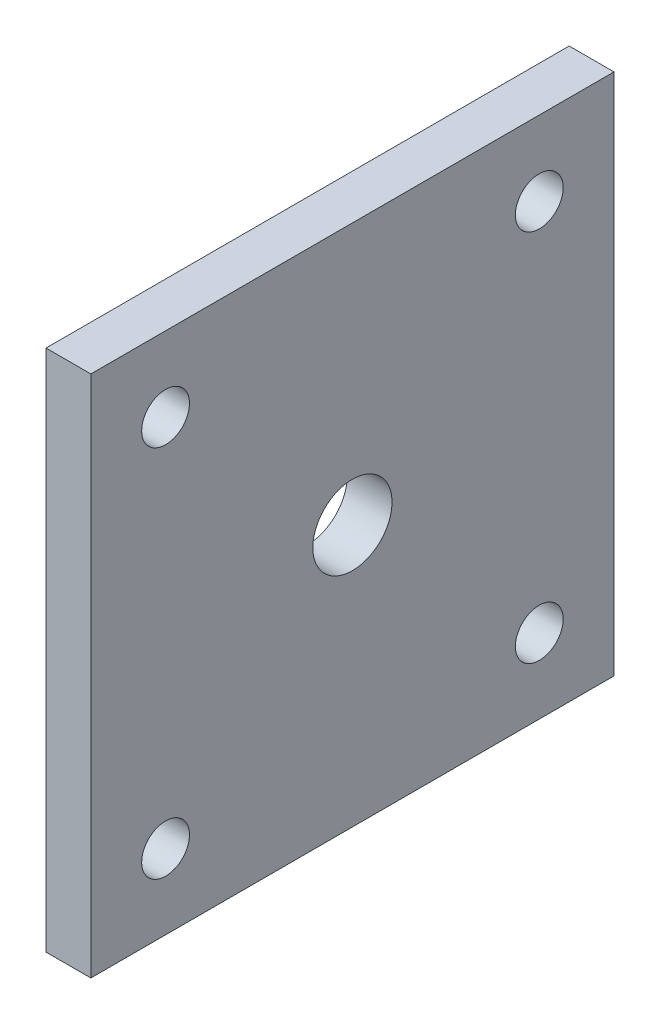
ISO-10303-21;
HEADER;
FILE_DESCRIPTION(('STEP AP214'),'2;1');
FILE_NAME('part.step','',(''),(''),'','','');
FILE_SCHEMA(('AUTOMOTIVE_DESIGN { 1 0 10303 214 1 1 1 1 }'));
ENDSEC;
DATA;
#1=APPLICATION_CONTEXT('core data for automotive mechanical design processes');
#2=APPLICATION_PROTOCOL_DEFINITION('international standard','automotive_design',2000,#1);
#3=PRODUCT_CONTEXT('',#1,'mechanical');
#4=PRODUCT('Part','Part','',(#3));
#5=PRODUCT_RELATED_PRODUCT_CATEGORY('part','',(#4));
#6=PRODUCT_DEFINITION_FORMATION('','',#4);
#7=PRODUCT_DEFINITION_CONTEXT('part definition',#1,'design');
#8=PRODUCT_DEFINITION('design','',#6,#7);
#9=PRODUCT_DEFINITION_SHAPE('','',#8);
#10=(LENGTH_UNIT() NAMED_UNIT(*) SI_UNIT(.MILLI.,.METRE.));
#11=(NAMED_UNIT(*) PLANE_ANGLE_UNIT() SI_UNIT($,.RADIAN.));
#12=(NAMED_UNIT(*) SI_UNIT($,.STERADIAN.) SOLID_ANGLE_UNIT());
#13=UNCERTAINTY_MEASURE_WITH_UNIT(LENGTH_MEASURE(1.E-05),#10,'distance_accuracy_value','');
#14=(GEOMETRIC_REPRESENTATION_CONTEXT(3) GLOBAL_UNCERTAINTY_ASSIGNED_CONTEXT((#13)) GLOBAL_UNIT_ASSIGNED_CONTEXT((#10,
#11,#12)) REPRESENTATION_CONTEXT('',''));
#15=CARTESIAN_POINT('',(0.,0.,0.));
#16=DIRECTION('',(0.,0.,1.));
#17=DIRECTION('',(1.,0.,0.));
#18=AXIS2_PLACEMENT_3D('',#15,#16,#17);
#19=CARTESIAN_POINT('',(3.,17.5,-17.5));
#20=DIRECTION('',(0.,0.,1.));
#21=DIRECTION('',(1.,0.,0.));
#22=AXIS2_PLACEMENT_3D('',#19,#20,#21);
#23=PLANE('',#22);
#24=DIRECTION('',(0.,1.,0.));
#25=VECTOR('',#24,1.);
#26=CARTESIAN_POINT('',(0.,17.5,-17.5));
#27=LINE('',#26,#25);
#28=CARTESIAN_POINT('',(0.,-17.5,-17.5));
#29=VERTEX_POINT('',#28);
#30=CARTESIAN_POINT('',(0.,17.5,-17.5));
#31=VERTEX_POINT('',#30);
#32=EDGE_CURVE('E112',#29,#31,#27,.T.);
#33=ORIENTED_EDGE('',*,*,#32,.T.);
#34=DIRECTION('',(-1.,0.,0.));
#35=VECTOR('',#34,1.);
#36=CARTESIAN_POINT('',(3.,17.5,-17.5));
#37=LINE('',#36,#35);
#38=CARTESIAN_POINT('',(3.,17.5,-17.5));
#39=VERTEX_POINT('',#38);
#40=EDGE_CURVE('E11',#39,#31,#37,.T.);
#41=ORIENTED_EDGE('',*,*,#40,.F.);
#42=DIRECTION('',(0.,1.,0.));
#43=VECTOR('',#42,1.);
#44=CARTESIAN_POINT('',(3.,17.5,-17.5));
#45=LINE('',#44,#43);
#46=CARTESIAN_POINT('',(3.,-17.5,-17.5));
#47=VERTEX_POINT('',#46);
#48=EDGE_CURVE('E99',#47,#39,#45,.T.);
#49=ORIENTED_EDGE('',*,*,#48,.F.);
#50=DIRECTION('',(-1.,0.,0.));
#51=VECTOR('',#50,1.);
#52=CARTESIAN_POINT('',(3.,-17.5,-17.5));
#53=LINE('',#52,#51);
#54=EDGE_CURVE('E108',#47,#29,#53,.T.);
#55=ORIENTED_EDGE('',*,*,#54,.T.);
#56=EDGE_LOOP('',(#33,#41,#49,#55));
#57=FACE_BOUND('',#56,.T.);
#58=ADVANCED_FACE('F45',(#57),#23,.F.);
#59=CARTESIAN_POINT('',(3.,17.5,17.5));
#60=DIRECTION('',(0.,-1.,0.));
#61=DIRECTION('',(0.,0.,-1.));
#62=AXIS2_PLACEMENT_3D('',#59,#60,#61);
#63=PLANE('',#62);
#64=DIRECTION('',(0.,0.,1.));
#65=VECTOR('',#64,1.);
#66=CARTESIAN_POINT('',(0.,17.5,17.5));
#67=LINE('',#66,#65);
#68=CARTESIAN_POINT('',(0.,17.5,17.5));
#69=VERTEX_POINT('',#68);
#70=EDGE_CURVE('E104',#31,#69,#67,.T.);
#71=ORIENTED_EDGE('',*,*,#70,.T.);
#72=DIRECTION('',(-1.,0.,0.));
#73=VECTOR('',#72,1.);
#74=CARTESIAN_POINT('',(3.,17.5,17.5));
#75=LINE('',#74,#73);
#76=CARTESIAN_POINT('',(3.,17.5,17.5));
#77=VERTEX_POINT('',#76);
#78=EDGE_CURVE('E54',#77,#69,#75,.T.);
#79=ORIENTED_EDGE('',*,*,#78,.F.);
#80=DIRECTION('',(0.,0.,1.));
#81=VECTOR('',#80,1.);
#82=CARTESIAN_POINT('',(3.,17.5,17.5));
#83=LINE('',#82,#81);
#84=EDGE_CURVE('E94',#39,#77,#83,.T.);
#85=ORIENTED_EDGE('',*,*,#84,.F.);
#86=ORIENTED_EDGE('',*,*,#40,.T.);
#87=EDGE_LOOP('',(#71,#79,#85,#86));
#88=FACE_BOUND('',#87,.T.);
#89=ADVANCED_FACE('F103',(#88),#63,.F.);
#90=CARTESIAN_POINT('',(3.,17.5,17.5));
#91=DIRECTION('',(0.,0.,-1.));
#92=DIRECTION('',(-1.,0.,0.));
#93=AXIS2_PLACEMENT_3D('',#90,#91,#92);
#94=PLANE('',#93);
#95=DIRECTION('',(0.,-1.,0.));
#96=VECTOR('',#95,1.);
#97=CARTESIAN_POINT('',(0.,17.5,17.5));
#98=LINE('',#97,#96);
#99=CARTESIAN_POINT('',(0.,-17.5,17.5));
#100=VERTEX_POINT('',#99);
#101=EDGE_CURVE('E80',#69,#100,#98,.T.);
#102=ORIENTED_EDGE('',*,*,#101,.T.);
#103=DIRECTION('',(-1.,0.,0.));
#104=VECTOR('',#103,1.);
#105=CARTESIAN_POINT('',(3.,-17.5,17.5));
#106=LINE('',#105,#104);
#107=CARTESIAN_POINT('',(3.,-17.5,17.5));
#108=VERTEX_POINT('',#107);
#109=EDGE_CURVE('E105',#108,#100,#106,.T.);
#110=ORIENTED_EDGE('',*,*,#109,.F.);
#111=DIRECTION('',(0.,-1.,0.));
#112=VECTOR('',#111,1.);
#113=CARTESIAN_POINT('',(3.,17.5,17.5));
#114=LINE('',#113,#112);
#115=EDGE_CURVE('E97',#77,#108,#114,.T.);
#116=ORIENTED_EDGE('',*,*,#115,.F.);
#117=ORIENTED_EDGE('',*,*,#78,.T.);
#118=EDGE_LOOP('',(#102,#110,#116,#117));
#119=FACE_BOUND('',#118,.T.);
#120=ADVANCED_FACE('F106',(#119),#94,.F.);
#121=CARTESIAN_POINT('',(3.,-17.5,17.5));
#122=DIRECTION('',(0.,1.,0.));
#123=DIRECTION('',(0.,0.,1.));
#124=AXIS2_PLACEMENT_3D('',#121,#122,#123);
#125=PLANE('',#124);
#126=DIRECTION('',(0.,0.,-1.));
#127=VECTOR('',#126,1.);
#128=CARTESIAN_POINT('',(0.,-17.5,17.5));
#129=LINE('',#128,#127);
#130=EDGE_CURVE('E86',#100,#29,#129,.T.);
#131=ORIENTED_EDGE('',*,*,#130,.T.);
#132=ORIENTED_EDGE('',*,*,#54,.F.);
#133=DIRECTION('',(0.,0.,-1.));
#134=VECTOR('',#133,1.);
#135=CARTESIAN_POINT('',(3.,-17.5,17.5));
#136=LINE('',#135,#134);
#137=EDGE_CURVE('E62',#108,#47,#136,.T.);
#138=ORIENTED_EDGE('',*,*,#137,.F.);
#139=ORIENTED_EDGE('',*,*,#109,.T.);
#140=EDGE_LOOP('',(#131,#132,#138,#139));
#141=FACE_BOUND('',#140,.T.);
#142=ADVANCED_FACE('F122',(#141),#125,.F.);
#143=CARTESIAN_POINT('',(3.,0.,0.));
#144=DIRECTION('',(1.,0.,0.));
#145=DIRECTION('',(0.,0.,-1.));
#146=AXIS2_PLACEMENT_3D('',#143,#144,#145);
#147=PLANE('',#146);
#148=CARTESIAN_POINT('',(3.,0.,0.));
#149=DIRECTION('',(-1.,0.,0.));
#150=DIRECTION('',(0.,0.,1.));
#151=AXIS2_PLACEMENT_3D('',#148,#149,#150);
#152=CIRCLE('',#151,2.65);
#153=CARTESIAN_POINT('',(3.,0.,2.65));
#154=VERTEX_POINT('',#153);
#155=EDGE_CURVE('E142',#154,#154,#152,.T.);
#156=ORIENTED_EDGE('',*,*,#155,.T.);
#157=EDGE_LOOP('',(#156));
#158=FACE_BOUND('',#157,.T.);
#159=CARTESIAN_POINT('',(3.,12.5,12.5));
#160=DIRECTION('',(-1.,0.,0.));
#161=DIRECTION('',(0.,0.,1.));
#162=AXIS2_PLACEMENT_3D('',#159,#160,#161);
#163=CIRCLE('',#162,1.6);
#164=CARTESIAN_POINT('',(3.,12.5,14.1));
#165=VERTEX_POINT('',#164);
#166=EDGE_CURVE('E138',#165,#165,#163,.T.);
#167=ORIENTED_EDGE('',*,*,#166,.T.);
#168=EDGE_LOOP('',(#167));
#169=FACE_BOUND('',#168,.T.);
#170=CARTESIAN_POINT('',(3.,-12.5,12.5));
#171=DIRECTION('',(-1.,0.,0.));
#172=DIRECTION('',(0.,0.,1.));
#173=AXIS2_PLACEMENT_3D('',#170,#171,#172);
#174=CIRCLE('',#173,1.6);
#175=CARTESIAN_POINT('',(3.,-12.5,14.1));
#176=VERTEX_POINT('',#175);
#177=EDGE_CURVE('E145',#176,#176,#174,.T.);
#178=ORIENTED_EDGE('',*,*,#177,.T.);
#179=EDGE_LOOP('',(#178));
#180=FACE_BOUND('',#179,.T.);
#181=CARTESIAN_POINT('',(3.,-12.5,-12.5));
#182=DIRECTION('',(-1.,0.,0.));
#183=DIRECTION('',(0.,0.,1.));
#184=AXIS2_PLACEMENT_3D('',#181,#182,#183);
#185=CIRCLE('',#184,1.6);
#186=CARTESIAN_POINT('',(3.,-12.5,-10.9));
#187=VERTEX_POINT('',#186);
#188=EDGE_CURVE('E151',#187,#187,#185,.T.);
#189=ORIENTED_EDGE('',*,*,#188,.T.);
#190=EDGE_LOOP('',(#189));
#191=FACE_BOUND('',#190,.T.);
#192=CARTESIAN_POINT('',(3.,12.5,-12.5));
#193=DIRECTION('',(-1.,0.,0.));
#194=DIRECTION('',(0.,0.,1.));
#195=AXIS2_PLACEMENT_3D('',#192,#193,#194);
#196=CIRCLE('',#195,1.6);
#197=CARTESIAN_POINT('',(3.,12.5,-10.9));
#198=VERTEX_POINT('',#197);
#199=EDGE_CURVE('E116',#198,#198,#196,.T.);
#200=ORIENTED_EDGE('',*,*,#199,.T.);
#201=EDGE_LOOP('',(#200));
#202=FACE_BOUND('',#201,.T.);
#203=ORIENTED_EDGE('',*,*,#48,.T.);
#204=ORIENTED_EDGE('',*,*,#84,.T.);
#205=ORIENTED_EDGE('',*,*,#115,.T.);
#206=ORIENTED_EDGE('',*,*,#137,.T.);
#207=EDGE_LOOP('',(#203,#204,#205,#206));
#208=FACE_BOUND('',#207,.T.);
#209=ADVANCED_FACE('F95',(#158,#169,#180,#191,#202,#208),#147,.T.);
#210=CARTESIAN_POINT('',(0.,0.,0.));
#211=DIRECTION('',(1.,0.,0.));
#212=DIRECTION('',(0.,0.,-1.));
#213=AXIS2_PLACEMENT_3D('',#210,#211,#212);
#214=PLANE('',#213);
#215=CARTESIAN_POINT('',(0.,0.,0.));
#216=DIRECTION('',(-1.,0.,0.));
#217=DIRECTION('',(0.,0.,1.));
#218=AXIS2_PLACEMENT_3D('',#215,#216,#217);
#219=CIRCLE('',#218,2.65);
#220=CARTESIAN_POINT('',(0.,0.,2.65));
#221=VERTEX_POINT('',#220);
#222=EDGE_CURVE('E158',#221,#221,#219,.T.);
#223=ORIENTED_EDGE('',*,*,#222,.F.);
#224=EDGE_LOOP('',(#223));
#225=FACE_BOUND('',#224,.T.);
#226=CARTESIAN_POINT('',(0.,12.5,12.5));
#227=DIRECTION('',(-1.,0.,0.));
#228=DIRECTION('',(0.,0.,1.));
#229=AXIS2_PLACEMENT_3D('',#226,#227,#228);
#230=CIRCLE('',#229,1.6);
#231=CARTESIAN_POINT('',(0.,12.5,14.1));
#232=VERTEX_POINT('',#231);
#233=EDGE_CURVE('E141',#232,#232,#230,.T.);
#234=ORIENTED_EDGE('',*,*,#233,.F.);
#235=EDGE_LOOP('',(#234));
#236=FACE_BOUND('',#235,.T.);
#237=CARTESIAN_POINT('',(0.,-12.5,12.5));
#238=DIRECTION('',(-1.,0.,0.));
#239=DIRECTION('',(0.,0.,1.));
#240=AXIS2_PLACEMENT_3D('',#237,#238,#239);
#241=CIRCLE('',#240,1.6);
#242=CARTESIAN_POINT('',(0.,-12.5,14.1));
#243=VERTEX_POINT('',#242);
#244=EDGE_CURVE('E148',#243,#243,#241,.T.);
#245=ORIENTED_EDGE('',*,*,#244,.F.);
#246=EDGE_LOOP('',(#245));
#247=FACE_BOUND('',#246,.T.);
#248=CARTESIAN_POINT('',(0.,-12.5,-12.5));
#249=DIRECTION('',(-1.,0.,0.));
#250=DIRECTION('',(0.,0.,1.));
#251=AXIS2_PLACEMENT_3D('',#248,#249,#250);
#252=CIRCLE('',#251,1.6);
#253=CARTESIAN_POINT('',(0.,-12.5,-10.9));
#254=VERTEX_POINT('',#253);
#255=EDGE_CURVE('E135',#254,#254,#252,.T.);
#256=ORIENTED_EDGE('',*,*,#255,.F.);
#257=EDGE_LOOP('',(#256));
#258=FACE_BOUND('',#257,.T.);
#259=CARTESIAN_POINT('',(0.,12.5,-12.5));
#260=DIRECTION('',(-1.,0.,0.));
#261=DIRECTION('',(0.,0.,1.));
#262=AXIS2_PLACEMENT_3D('',#259,#260,#261);
#263=CIRCLE('',#262,1.6);
#264=CARTESIAN_POINT('',(0.,12.5,-10.9));
#265=VERTEX_POINT('',#264);
#266=EDGE_CURVE('E131',#265,#265,#263,.T.);
#267=ORIENTED_EDGE('',*,*,#266,.F.);
#268=EDGE_LOOP('',(#267));
#269=FACE_BOUND('',#268,.T.);
#270=ORIENTED_EDGE('',*,*,#32,.F.);
#271=ORIENTED_EDGE('',*,*,#130,.F.);
#272=ORIENTED_EDGE('',*,*,#101,.F.);
#273=ORIENTED_EDGE('',*,*,#70,.F.);
#274=EDGE_LOOP('',(#270,#271,#272,#273));
#275=FACE_BOUND('',#274,.T.);
#276=ADVANCED_FACE('F125',(#225,#236,#247,#258,#269,#275),#214,.F.);
#277=CARTESIAN_POINT('',(3.,12.5,-12.5));
#278=DIRECTION('',(-1.,0.,0.));
#279=DIRECTION('',(0.,0.,1.));
#280=AXIS2_PLACEMENT_3D('',#277,#278,#279);
#281=CYLINDRICAL_SURFACE('',#280,1.6);
#282=ORIENTED_EDGE('',*,*,#199,.F.);
#283=EDGE_LOOP('',(#282));
#284=FACE_BOUND('',#283,.T.);
#285=ORIENTED_EDGE('',*,*,#266,.T.);
#286=EDGE_LOOP('',(#285));
#287=FACE_BOUND('',#286,.T.);
#288=ADVANCED_FACE('F176',(#284,#287),#281,.F.);
#289=CARTESIAN_POINT('',(3.,-12.5,-12.5));
#290=DIRECTION('',(-1.,0.,0.));
#291=DIRECTION('',(0.,0.,1.));
#292=AXIS2_PLACEMENT_3D('',#289,#290,#291);
#293=CYLINDRICAL_SURFACE('',#292,1.6);
#294=ORIENTED_EDGE('',*,*,#188,.F.);
#295=EDGE_LOOP('',(#294));
#296=FACE_BOUND('',#295,.T.);
#297=ORIENTED_EDGE('',*,*,#255,.T.);
#298=EDGE_LOOP('',(#297));
#299=FACE_BOUND('',#298,.T.);
#300=ADVANCED_FACE('F187',(#296,#299),#293,.F.);
#301=CARTESIAN_POINT('',(3.,-12.5,12.5));
#302=DIRECTION('',(-1.,0.,0.));
#303=DIRECTION('',(0.,0.,1.));
#304=AXIS2_PLACEMENT_3D('',#301,#302,#303);
#305=CYLINDRICAL_SURFACE('',#304,1.6);
#306=ORIENTED_EDGE('',*,*,#177,.F.);
#307=EDGE_LOOP('',(#306));
#308=FACE_BOUND('',#307,.T.);
#309=ORIENTED_EDGE('',*,*,#244,.T.);
#310=EDGE_LOOP('',(#309));
#311=FACE_BOUND('',#310,.T.);
#312=ADVANCED_FACE('F194',(#308,#311),#305,.F.);
#313=CARTESIAN_POINT('',(3.,12.5,12.5));
#314=DIRECTION('',(-1.,0.,0.));
#315=DIRECTION('',(0.,0.,1.));
#316=AXIS2_PLACEMENT_3D('',#313,#314,#315);
#317=CYLINDRICAL_SURFACE('',#316,1.6);
#318=ORIENTED_EDGE('',*,*,#166,.F.);
#319=EDGE_LOOP('',(#318));
#320=FACE_BOUND('',#319,.T.);
#321=ORIENTED_EDGE('',*,*,#233,.T.);
#322=EDGE_LOOP('',(#321));
#323=FACE_BOUND('',#322,.T.);
#324=ADVANCED_FACE('F170',(#320,#323),#317,.F.);
#325=CARTESIAN_POINT('',(3.,0.,0.));
#326=DIRECTION('',(-1.,0.,0.));
#327=DIRECTION('',(0.,0.,1.));
#328=AXIS2_PLACEMENT_3D('',#325,#326,#327);
#329=CYLINDRICAL_SURFACE('',#328,2.65);
#330=ORIENTED_EDGE('',*,*,#155,.F.);
#331=EDGE_LOOP('',(#330));
#332=FACE_BOUND('',#331,.T.);
#333=ORIENTED_EDGE('',*,*,#222,.T.);
#334=EDGE_LOOP('',(#333));
#335=FACE_BOUND('',#334,.T.);
#336=ADVANCED_FACE('F167',(#332,#335),#329,.F.);
#337=CLOSED_SHELL('',(#58,#89,#120,#142,#209,#276,#288,#300,#312,#324,#336));
#338=MANIFOLD_SOLID_BREP('B2',#337);
#339=ADVANCED_BREP_SHAPE_REPRESENTATION('',(#18,#338),#14);
#340=SHAPE_DEFINITION_REPRESENTATION(#9,#339);
ENDSEC;
END-ISO-10303-21;
